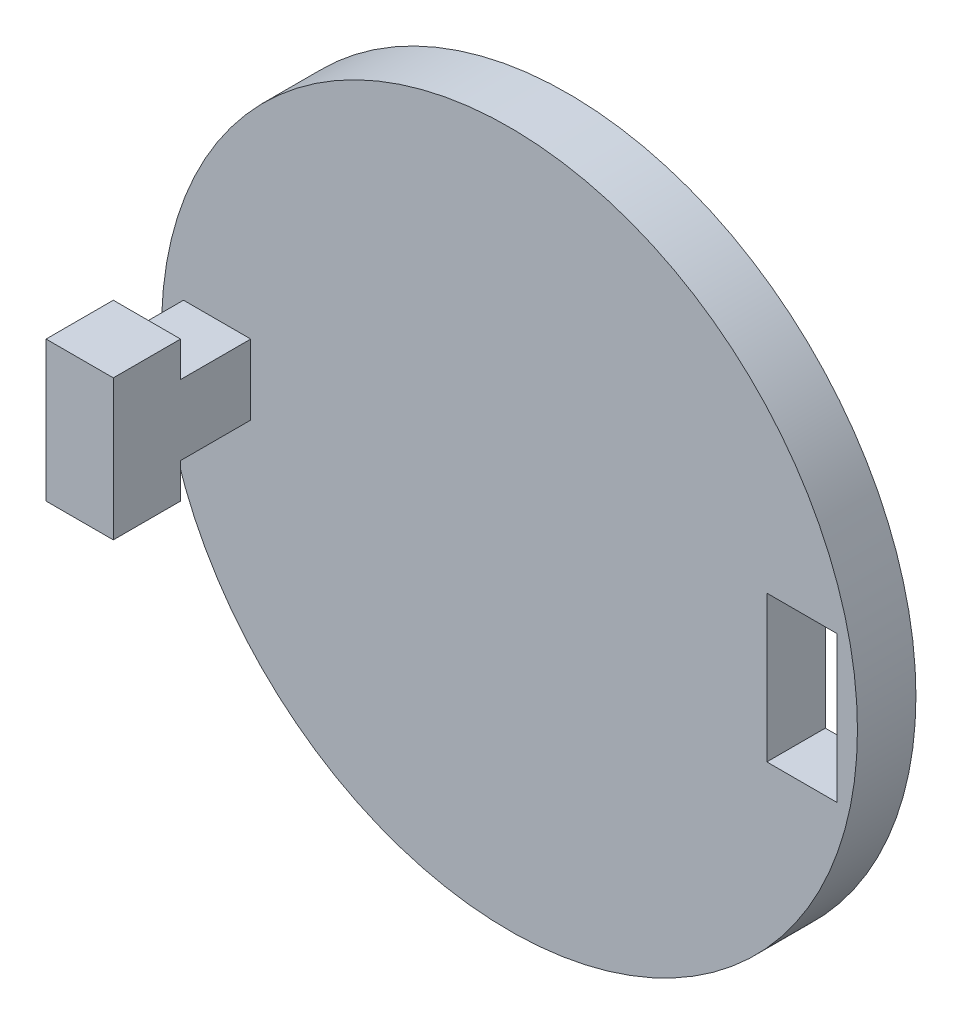
ISO-10303-21;
HEADER;
FILE_DESCRIPTION(('STEP AP214'),'2;1');
FILE_NAME('part.step','',(''),(''),'','','');
FILE_SCHEMA(('AUTOMOTIVE_DESIGN { 1 0 10303 214 1 1 1 1 }'));
ENDSEC;
DATA;
#1=APPLICATION_CONTEXT('core data for automotive mechanical design processes');
#2=APPLICATION_PROTOCOL_DEFINITION('international standard','automotive_design',2000,#1);
#3=PRODUCT_CONTEXT('',#1,'mechanical');
#4=PRODUCT('Part','Part','',(#3));
#5=PRODUCT_RELATED_PRODUCT_CATEGORY('part','',(#4));
#6=PRODUCT_DEFINITION_FORMATION('','',#4);
#7=PRODUCT_DEFINITION_CONTEXT('part definition',#1,'design');
#8=PRODUCT_DEFINITION('design','',#6,#7);
#9=PRODUCT_DEFINITION_SHAPE('','',#8);
#10=(LENGTH_UNIT() NAMED_UNIT(*) SI_UNIT(.MILLI.,.METRE.));
#11=(NAMED_UNIT(*) PLANE_ANGLE_UNIT() SI_UNIT($,.RADIAN.));
#12=(NAMED_UNIT(*) SI_UNIT($,.STERADIAN.) SOLID_ANGLE_UNIT());
#13=UNCERTAINTY_MEASURE_WITH_UNIT(LENGTH_MEASURE(1.E-05),#10,'distance_accuracy_value','');
#14=(GEOMETRIC_REPRESENTATION_CONTEXT(3) GLOBAL_UNCERTAINTY_ASSIGNED_CONTEXT((#13)) GLOBAL_UNIT_ASSIGNED_CONTEXT((#10,
#11,#12)) REPRESENTATION_CONTEXT('',''));
#15=CARTESIAN_POINT('',(0.,0.,0.));
#16=DIRECTION('',(0.,0.,1.));
#17=DIRECTION('',(1.,0.,0.));
#18=AXIS2_PLACEMENT_3D('',#15,#16,#17);
#19=CARTESIAN_POINT('',(-11.15,-1.2,6.7));
#20=DIRECTION('',(0.,1.,0.));
#21=DIRECTION('',(0.,0.,1.));
#22=AXIS2_PLACEMENT_3D('',#19,#20,#21);
#23=PLANE('',#22);
#24=DIRECTION('',(1.,0.,0.));
#25=VECTOR('',#24,1.);
#26=CARTESIAN_POINT('',(-11.15,-1.2,4.4));
#27=LINE('',#26,#25);
#28=CARTESIAN_POINT('',(-11.15,-1.2,4.4));
#29=VERTEX_POINT('',#28);
#30=CARTESIAN_POINT('',(-8.85,-1.2,4.4));
#31=VERTEX_POINT('',#30);
#32=EDGE_CURVE('E145',#29,#31,#27,.T.);
#33=ORIENTED_EDGE('',*,*,#32,.F.);
#34=DIRECTION('',(0.,0.,-1.));
#35=VECTOR('',#34,1.);
#36=CARTESIAN_POINT('',(-11.15,-1.2,6.7));
#37=LINE('',#36,#35);
#38=CARTESIAN_POINT('',(-11.15,-1.2,2.));
#39=VERTEX_POINT('',#38);
#40=EDGE_CURVE('E51',#29,#39,#37,.T.);
#41=ORIENTED_EDGE('',*,*,#40,.T.);
#42=DIRECTION('',(1.,0.,0.));
#43=VECTOR('',#42,1.);
#44=CARTESIAN_POINT('',(-11.15,-1.2,2.));
#45=LINE('',#44,#43);
#46=CARTESIAN_POINT('',(-8.85,-1.2,2.));
#47=VERTEX_POINT('',#46);
#48=EDGE_CURVE('E174',#39,#47,#45,.T.);
#49=ORIENTED_EDGE('',*,*,#48,.T.);
#50=DIRECTION('',(0.,0.,-1.));
#51=VECTOR('',#50,1.);
#52=CARTESIAN_POINT('',(-8.85,-1.2,6.7));
#53=LINE('',#52,#51);
#54=EDGE_CURVE('E176',#31,#47,#53,.T.);
#55=ORIENTED_EDGE('',*,*,#54,.F.);
#56=EDGE_LOOP('',(#33,#41,#49,#55));
#57=FACE_BOUND('',#56,.T.);
#58=ADVANCED_FACE('F36',(#57),#23,.F.);
#59=CARTESIAN_POINT('',(-11.15,1.2,6.7));
#60=DIRECTION('',(0.,-1.,0.));
#61=DIRECTION('',(1.,0.,0.));
#62=AXIS2_PLACEMENT_3D('',#59,#60,#61);
#63=PLANE('',#62);
#64=DIRECTION('',(-1.,0.,0.));
#65=VECTOR('',#64,1.);
#66=CARTESIAN_POINT('',(-8.85,1.2,4.4));
#67=LINE('',#66,#65);
#68=CARTESIAN_POINT('',(-8.85,1.2,4.4));
#69=VERTEX_POINT('',#68);
#70=CARTESIAN_POINT('',(-11.15,1.2,4.4));
#71=VERTEX_POINT('',#70);
#72=EDGE_CURVE('E148',#69,#71,#67,.T.);
#73=ORIENTED_EDGE('',*,*,#72,.F.);
#74=DIRECTION('',(0.,0.,-1.));
#75=VECTOR('',#74,1.);
#76=CARTESIAN_POINT('',(-8.85,1.2,6.7));
#77=LINE('',#76,#75);
#78=CARTESIAN_POINT('',(-8.85,1.2,2.));
#79=VERTEX_POINT('',#78);
#80=EDGE_CURVE('E189',#69,#79,#77,.T.);
#81=ORIENTED_EDGE('',*,*,#80,.T.);
#82=DIRECTION('',(-1.,0.,0.));
#83=VECTOR('',#82,1.);
#84=CARTESIAN_POINT('',(-11.15,1.2,2.));
#85=LINE('',#84,#83);
#86=CARTESIAN_POINT('',(-11.15,1.2,2.));
#87=VERTEX_POINT('',#86);
#88=EDGE_CURVE('E179',#79,#87,#85,.T.);
#89=ORIENTED_EDGE('',*,*,#88,.T.);
#90=DIRECTION('',(0.,0.,-1.));
#91=VECTOR('',#90,1.);
#92=CARTESIAN_POINT('',(-11.15,1.2,6.7));
#93=LINE('',#92,#91);
#94=EDGE_CURVE('E187',#71,#87,#93,.T.);
#95=ORIENTED_EDGE('',*,*,#94,.F.);
#96=EDGE_LOOP('',(#73,#81,#89,#95));
#97=FACE_BOUND('',#96,.T.);
#98=ADVANCED_FACE('F254',(#97),#63,.F.);
#99=CARTESIAN_POINT('',(0.,0.,2.));
#100=DIRECTION('',(0.,0.,1.));
#101=DIRECTION('',(1.,0.,0.));
#102=AXIS2_PLACEMENT_3D('',#99,#100,#101);
#103=PLANE('',#102);
#104=CARTESIAN_POINT('',(0.,0.,2.));
#105=DIRECTION('',(0.,0.,1.));
#106=DIRECTION('',(1.,0.,0.));
#107=AXIS2_PLACEMENT_3D('',#104,#105,#106);
#108=CIRCLE('',#107,11.9);
#109=CARTESIAN_POINT('',(11.9,0.,2.));
#110=VERTEX_POINT('',#109);
#111=EDGE_CURVE('E11',#110,#110,#108,.T.);
#112=ORIENTED_EDGE('',*,*,#111,.T.);
#113=EDGE_LOOP('',(#112));
#114=FACE_BOUND('',#113,.T.);
#115=DIRECTION('',(-1.,0.,0.));
#116=VECTOR('',#115,1.);
#117=CARTESIAN_POINT('',(8.8,2.5,2.));
#118=LINE('',#117,#116);
#119=CARTESIAN_POINT('',(11.2,2.5,2.));
#120=VERTEX_POINT('',#119);
#121=CARTESIAN_POINT('',(8.8,2.5,2.));
#122=VERTEX_POINT('',#121);
#123=EDGE_CURVE('E194',#120,#122,#118,.T.);
#124=ORIENTED_EDGE('',*,*,#123,.F.);
#125=DIRECTION('',(0.,1.,0.));
#126=VECTOR('',#125,1.);
#127=CARTESIAN_POINT('',(11.2,2.5,2.));
#128=LINE('',#127,#126);
#129=CARTESIAN_POINT('',(11.2,-2.5,2.));
#130=VERTEX_POINT('',#129);
#131=EDGE_CURVE('E192',#130,#120,#128,.T.);
#132=ORIENTED_EDGE('',*,*,#131,.F.);
#133=DIRECTION('',(1.,0.,0.));
#134=VECTOR('',#133,1.);
#135=CARTESIAN_POINT('',(8.8,-2.5,2.));
#136=LINE('',#135,#134);
#137=CARTESIAN_POINT('',(8.8,-2.5,2.));
#138=VERTEX_POINT('',#137);
#139=EDGE_CURVE('E199',#138,#130,#136,.T.);
#140=ORIENTED_EDGE('',*,*,#139,.F.);
#141=DIRECTION('',(0.,-1.,0.));
#142=VECTOR('',#141,1.);
#143=CARTESIAN_POINT('',(8.8,2.5,2.));
#144=LINE('',#143,#142);
#145=EDGE_CURVE('E197',#122,#138,#144,.T.);
#146=ORIENTED_EDGE('',*,*,#145,.F.);
#147=EDGE_LOOP('',(#124,#132,#140,#146));
#148=FACE_BOUND('',#147,.T.);
#149=ORIENTED_EDGE('',*,*,#88,.F.);
#150=DIRECTION('',(0.,1.,0.));
#151=VECTOR('',#150,1.);
#152=CARTESIAN_POINT('',(-8.85,1.2,2.));
#153=LINE('',#152,#151);
#154=EDGE_CURVE('E170',#47,#79,#153,.T.);
#155=ORIENTED_EDGE('',*,*,#154,.F.);
#156=ORIENTED_EDGE('',*,*,#48,.F.);
#157=DIRECTION('',(0.,-1.,0.));
#158=VECTOR('',#157,1.);
#159=CARTESIAN_POINT('',(-11.15,1.2,2.));
#160=LINE('',#159,#158);
#161=EDGE_CURVE('E182',#87,#39,#160,.T.);
#162=ORIENTED_EDGE('',*,*,#161,.F.);
#163=EDGE_LOOP('',(#149,#155,#156,#162));
#164=FACE_BOUND('',#163,.T.);
#165=ADVANCED_FACE('F228',(#114,#148,#164),#103,.T.);
#166=CARTESIAN_POINT('',(0.,0.,0.));
#167=DIRECTION('',(0.,0.,1.));
#168=DIRECTION('',(1.,0.,0.));
#169=AXIS2_PLACEMENT_3D('',#166,#167,#168);
#170=PLANE('',#169);
#171=CARTESIAN_POINT('',(0.,0.,0.));
#172=DIRECTION('',(0.,0.,1.));
#173=DIRECTION('',(1.,0.,0.));
#174=AXIS2_PLACEMENT_3D('',#171,#172,#173);
#175=CIRCLE('',#174,11.9);
#176=CARTESIAN_POINT('',(11.9,0.,0.));
#177=VERTEX_POINT('',#176);
#178=EDGE_CURVE('E40',#177,#177,#175,.T.);
#179=ORIENTED_EDGE('',*,*,#178,.F.);
#180=EDGE_LOOP('',(#179));
#181=FACE_BOUND('',#180,.T.);
#182=DIRECTION('',(0.,1.,0.));
#183=VECTOR('',#182,1.);
#184=CARTESIAN_POINT('',(11.2,2.5,0.));
#185=LINE('',#184,#183);
#186=CARTESIAN_POINT('',(11.2,-2.5,0.));
#187=VERTEX_POINT('',#186);
#188=CARTESIAN_POINT('',(11.2,2.5,0.));
#189=VERTEX_POINT('',#188);
#190=EDGE_CURVE('E191',#187,#189,#185,.T.);
#191=ORIENTED_EDGE('',*,*,#190,.T.);
#192=DIRECTION('',(-1.,0.,0.));
#193=VECTOR('',#192,1.);
#194=CARTESIAN_POINT('',(8.8,2.5,0.));
#195=LINE('',#194,#193);
#196=CARTESIAN_POINT('',(8.8,2.5,0.));
#197=VERTEX_POINT('',#196);
#198=EDGE_CURVE('E204',#189,#197,#195,.T.);
#199=ORIENTED_EDGE('',*,*,#198,.T.);
#200=DIRECTION('',(0.,-1.,0.));
#201=VECTOR('',#200,1.);
#202=CARTESIAN_POINT('',(8.8,2.5,0.));
#203=LINE('',#202,#201);
#204=CARTESIAN_POINT('',(8.8,-2.5,0.));
#205=VERTEX_POINT('',#204);
#206=EDGE_CURVE('E207',#197,#205,#203,.T.);
#207=ORIENTED_EDGE('',*,*,#206,.T.);
#208=DIRECTION('',(1.,0.,0.));
#209=VECTOR('',#208,1.);
#210=CARTESIAN_POINT('',(8.8,-2.5,0.));
#211=LINE('',#210,#209);
#212=EDGE_CURVE('E195',#205,#187,#211,.T.);
#213=ORIENTED_EDGE('',*,*,#212,.T.);
#214=EDGE_LOOP('',(#191,#199,#207,#213));
#215=FACE_BOUND('',#214,.T.);
#216=ADVANCED_FACE('F225',(#181,#215),#170,.F.);
#217=CARTESIAN_POINT('',(0.,0.,2.));
#218=DIRECTION('',(0.,0.,-1.));
#219=DIRECTION('',(-1.,0.,0.));
#220=AXIS2_PLACEMENT_3D('',#217,#218,#219);
#221=CYLINDRICAL_SURFACE('',#220,11.9);
#222=ORIENTED_EDGE('',*,*,#111,.F.);
#223=EDGE_LOOP('',(#222));
#224=FACE_BOUND('',#223,.T.);
#225=ORIENTED_EDGE('',*,*,#178,.T.);
#226=EDGE_LOOP('',(#225));
#227=FACE_BOUND('',#226,.T.);
#228=ADVANCED_FACE('F38',(#224,#227),#221,.T.);
#229=CARTESIAN_POINT('',(11.2,2.5,2.));
#230=DIRECTION('',(-1.,0.,0.));
#231=DIRECTION('',(0.,-1.,0.));
#232=AXIS2_PLACEMENT_3D('',#229,#230,#231);
#233=PLANE('',#232);
#234=ORIENTED_EDGE('',*,*,#190,.F.);
#235=DIRECTION('',(0.,0.,-1.));
#236=VECTOR('',#235,1.);
#237=CARTESIAN_POINT('',(11.2,-2.5,2.));
#238=LINE('',#237,#236);
#239=EDGE_CURVE('E201',#130,#187,#238,.T.);
#240=ORIENTED_EDGE('',*,*,#239,.F.);
#241=ORIENTED_EDGE('',*,*,#131,.T.);
#242=DIRECTION('',(0.,0.,-1.));
#243=VECTOR('',#242,1.);
#244=CARTESIAN_POINT('',(11.2,2.5,2.));
#245=LINE('',#244,#243);
#246=EDGE_CURVE('E217',#120,#189,#245,.T.);
#247=ORIENTED_EDGE('',*,*,#246,.T.);
#248=EDGE_LOOP('',(#234,#240,#241,#247));
#249=FACE_BOUND('',#248,.T.);
#250=ADVANCED_FACE('F230',(#249),#233,.T.);
#251=CARTESIAN_POINT('',(8.8,2.5,2.));
#252=DIRECTION('',(0.,-1.,0.));
#253=DIRECTION('',(0.,0.,-1.));
#254=AXIS2_PLACEMENT_3D('',#251,#252,#253);
#255=PLANE('',#254);
#256=ORIENTED_EDGE('',*,*,#198,.F.);
#257=ORIENTED_EDGE('',*,*,#246,.F.);
#258=ORIENTED_EDGE('',*,*,#123,.T.);
#259=DIRECTION('',(0.,0.,-1.));
#260=VECTOR('',#259,1.);
#261=CARTESIAN_POINT('',(8.8,2.5,2.));
#262=LINE('',#261,#260);
#263=EDGE_CURVE('E215',#122,#197,#262,.T.);
#264=ORIENTED_EDGE('',*,*,#263,.T.);
#265=EDGE_LOOP('',(#256,#257,#258,#264));
#266=FACE_BOUND('',#265,.T.);
#267=ADVANCED_FACE('F239',(#266),#255,.T.);
#268=CARTESIAN_POINT('',(8.8,2.5,2.));
#269=DIRECTION('',(1.,0.,0.));
#270=DIRECTION('',(0.,0.,-1.));
#271=AXIS2_PLACEMENT_3D('',#268,#269,#270);
#272=PLANE('',#271);
#273=ORIENTED_EDGE('',*,*,#206,.F.);
#274=ORIENTED_EDGE('',*,*,#263,.F.);
#275=ORIENTED_EDGE('',*,*,#145,.T.);
#276=DIRECTION('',(0.,0.,-1.));
#277=VECTOR('',#276,1.);
#278=CARTESIAN_POINT('',(8.8,-2.5,2.));
#279=LINE('',#278,#277);
#280=EDGE_CURVE('E59',#138,#205,#279,.T.);
#281=ORIENTED_EDGE('',*,*,#280,.T.);
#282=EDGE_LOOP('',(#273,#274,#275,#281));
#283=FACE_BOUND('',#282,.T.);
#284=ADVANCED_FACE('F243',(#283),#272,.T.);
#285=CARTESIAN_POINT('',(8.8,-2.5,2.));
#286=DIRECTION('',(0.,1.,0.));
#287=DIRECTION('',(0.,0.,1.));
#288=AXIS2_PLACEMENT_3D('',#285,#286,#287);
#289=PLANE('',#288);
#290=ORIENTED_EDGE('',*,*,#212,.F.);
#291=ORIENTED_EDGE('',*,*,#280,.F.);
#292=ORIENTED_EDGE('',*,*,#139,.T.);
#293=ORIENTED_EDGE('',*,*,#239,.T.);
#294=EDGE_LOOP('',(#290,#291,#292,#293));
#295=FACE_BOUND('',#294,.T.);
#296=ADVANCED_FACE('F232',(#295),#289,.T.);
#297=CARTESIAN_POINT('',(-8.85,1.2,6.7));
#298=DIRECTION('',(-1.,0.,0.));
#299=DIRECTION('',(0.,0.,1.));
#300=AXIS2_PLACEMENT_3D('',#297,#298,#299);
#301=PLANE('',#300);
#302=ORIENTED_EDGE('',*,*,#154,.T.);
#303=ORIENTED_EDGE('',*,*,#80,.F.);
#304=DIRECTION('',(0.,-1.,0.));
#305=VECTOR('',#304,1.);
#306=CARTESIAN_POINT('',(-8.85,2.4,4.4));
#307=LINE('',#306,#305);
#308=CARTESIAN_POINT('',(-8.85,2.4,4.4));
#309=VERTEX_POINT('',#308);
#310=EDGE_CURVE('E168',#309,#69,#307,.T.);
#311=ORIENTED_EDGE('',*,*,#310,.F.);
#312=DIRECTION('',(0.,0.,-1.));
#313=VECTOR('',#312,1.);
#314=CARTESIAN_POINT('',(-8.85,2.4,6.7));
#315=LINE('',#314,#313);
#316=CARTESIAN_POINT('',(-8.85,2.4,6.7));
#317=VERTEX_POINT('',#316);
#318=EDGE_CURVE('E150',#317,#309,#315,.T.);
#319=ORIENTED_EDGE('',*,*,#318,.F.);
#320=DIRECTION('',(0.,1.,0.));
#321=VECTOR('',#320,1.);
#322=CARTESIAN_POINT('',(-8.85,1.2,6.7));
#323=LINE('',#322,#321);
#324=CARTESIAN_POINT('',(-8.85,-2.4,6.7));
#325=VERTEX_POINT('',#324);
#326=EDGE_CURVE('E171',#325,#317,#323,.T.);
#327=ORIENTED_EDGE('',*,*,#326,.F.);
#328=DIRECTION('',(0.,0.,1.));
#329=VECTOR('',#328,1.);
#330=CARTESIAN_POINT('',(-8.85,-2.4,6.7));
#331=LINE('',#330,#329);
#332=CARTESIAN_POINT('',(-8.85,-2.4,4.4));
#333=VERTEX_POINT('',#332);
#334=EDGE_CURVE('E136',#333,#325,#331,.T.);
#335=ORIENTED_EDGE('',*,*,#334,.F.);
#336=DIRECTION('',(0.,1.,0.));
#337=VECTOR('',#336,1.);
#338=CARTESIAN_POINT('',(-8.85,-2.4,4.4));
#339=LINE('',#338,#337);
#340=EDGE_CURVE('E132',#333,#31,#339,.T.);
#341=ORIENTED_EDGE('',*,*,#340,.T.);
#342=ORIENTED_EDGE('',*,*,#54,.T.);
#343=EDGE_LOOP('',(#302,#303,#311,#319,#327,#335,#341,#342));
#344=FACE_BOUND('',#343,.T.);
#345=ADVANCED_FACE('F250',(#344),#301,.F.);
#346=CARTESIAN_POINT('',(-11.15,1.2,6.7));
#347=DIRECTION('',(1.,0.,0.));
#348=DIRECTION('',(0.,0.,-1.));
#349=AXIS2_PLACEMENT_3D('',#346,#347,#348);
#350=PLANE('',#349);
#351=ORIENTED_EDGE('',*,*,#161,.T.);
#352=ORIENTED_EDGE('',*,*,#40,.F.);
#353=DIRECTION('',(0.,1.,0.));
#354=VECTOR('',#353,1.);
#355=CARTESIAN_POINT('',(-11.15,-2.4,4.4));
#356=LINE('',#355,#354);
#357=CARTESIAN_POINT('',(-11.15,-2.4,4.4));
#358=VERTEX_POINT('',#357);
#359=EDGE_CURVE('E130',#358,#29,#356,.T.);
#360=ORIENTED_EDGE('',*,*,#359,.F.);
#361=DIRECTION('',(0.,0.,-1.));
#362=VECTOR('',#361,1.);
#363=CARTESIAN_POINT('',(-11.15,-2.4,6.7));
#364=LINE('',#363,#362);
#365=CARTESIAN_POINT('',(-11.15,-2.4,6.7));
#366=VERTEX_POINT('',#365);
#367=EDGE_CURVE('E137',#366,#358,#364,.T.);
#368=ORIENTED_EDGE('',*,*,#367,.F.);
#369=DIRECTION('',(0.,-1.,0.));
#370=VECTOR('',#369,1.);
#371=CARTESIAN_POINT('',(-11.15,1.2,6.7));
#372=LINE('',#371,#370);
#373=CARTESIAN_POINT('',(-11.15,2.4,6.7));
#374=VERTEX_POINT('',#373);
#375=EDGE_CURVE('E173',#374,#366,#372,.T.);
#376=ORIENTED_EDGE('',*,*,#375,.F.);
#377=DIRECTION('',(0.,0.,1.));
#378=VECTOR('',#377,1.);
#379=CARTESIAN_POINT('',(-11.15,2.4,6.7));
#380=LINE('',#379,#378);
#381=CARTESIAN_POINT('',(-11.15,2.4,4.4));
#382=VERTEX_POINT('',#381);
#383=EDGE_CURVE('E159',#382,#374,#380,.T.);
#384=ORIENTED_EDGE('',*,*,#383,.F.);
#385=DIRECTION('',(0.,-1.,0.));
#386=VECTOR('',#385,1.);
#387=CARTESIAN_POINT('',(-11.15,2.4,4.4));
#388=LINE('',#387,#386);
#389=EDGE_CURVE('E164',#382,#71,#388,.T.);
#390=ORIENTED_EDGE('',*,*,#389,.T.);
#391=ORIENTED_EDGE('',*,*,#94,.T.);
#392=EDGE_LOOP('',(#351,#352,#360,#368,#376,#384,#390,#391));
#393=FACE_BOUND('',#392,.T.);
#394=ADVANCED_FACE('F147',(#393),#350,.F.);
#395=CARTESIAN_POINT('',(0.,0.,6.7));
#396=DIRECTION('',(0.,0.,1.));
#397=DIRECTION('',(1.,0.,0.));
#398=AXIS2_PLACEMENT_3D('',#395,#396,#397);
#399=PLANE('',#398);
#400=ORIENTED_EDGE('',*,*,#326,.T.);
#401=DIRECTION('',(1.,0.,0.));
#402=VECTOR('',#401,1.);
#403=CARTESIAN_POINT('',(-8.85,2.4,6.7));
#404=LINE('',#403,#402);
#405=EDGE_CURVE('E162',#374,#317,#404,.T.);
#406=ORIENTED_EDGE('',*,*,#405,.F.);
#407=ORIENTED_EDGE('',*,*,#375,.T.);
#408=DIRECTION('',(-1.,0.,0.));
#409=VECTOR('',#408,1.);
#410=CARTESIAN_POINT('',(-11.15,-2.4,6.7));
#411=LINE('',#410,#409);
#412=EDGE_CURVE('E143',#325,#366,#411,.T.);
#413=ORIENTED_EDGE('',*,*,#412,.F.);
#414=EDGE_LOOP('',(#400,#406,#407,#413));
#415=FACE_BOUND('',#414,.T.);
#416=ADVANCED_FACE('F263',(#415),#399,.T.);
#417=CARTESIAN_POINT('',(-8.85,2.4,4.4));
#418=DIRECTION('',(0.,0.,1.));
#419=DIRECTION('',(1.,0.,0.));
#420=AXIS2_PLACEMENT_3D('',#417,#418,#419);
#421=PLANE('',#420);
#422=ORIENTED_EDGE('',*,*,#72,.T.);
#423=ORIENTED_EDGE('',*,*,#389,.F.);
#424=DIRECTION('',(-1.,0.,0.));
#425=VECTOR('',#424,1.);
#426=CARTESIAN_POINT('',(-8.85,2.4,4.4));
#427=LINE('',#426,#425);
#428=EDGE_CURVE('E157',#309,#382,#427,.T.);
#429=ORIENTED_EDGE('',*,*,#428,.F.);
#430=ORIENTED_EDGE('',*,*,#310,.T.);
#431=EDGE_LOOP('',(#422,#423,#429,#430));
#432=FACE_BOUND('',#431,.T.);
#433=ADVANCED_FACE('F282',(#432),#421,.F.);
#434=CARTESIAN_POINT('',(0.,2.4,0.));
#435=DIRECTION('',(0.,1.,0.));
#436=DIRECTION('',(-1.,0.,0.));
#437=AXIS2_PLACEMENT_3D('',#434,#435,#436);
#438=PLANE('',#437);
#439=ORIENTED_EDGE('',*,*,#318,.T.);
#440=ORIENTED_EDGE('',*,*,#428,.T.);
#441=ORIENTED_EDGE('',*,*,#383,.T.);
#442=ORIENTED_EDGE('',*,*,#405,.T.);
#443=EDGE_LOOP('',(#439,#440,#441,#442));
#444=FACE_BOUND('',#443,.T.);
#445=ADVANCED_FACE('F286',(#444),#438,.T.);
#446=CARTESIAN_POINT('',(-11.15,-2.4,4.4));
#447=DIRECTION('',(0.,0.,1.));
#448=DIRECTION('',(1.,0.,0.));
#449=AXIS2_PLACEMENT_3D('',#446,#447,#448);
#450=PLANE('',#449);
#451=ORIENTED_EDGE('',*,*,#32,.T.);
#452=ORIENTED_EDGE('',*,*,#340,.F.);
#453=DIRECTION('',(1.,0.,0.));
#454=VECTOR('',#453,1.);
#455=CARTESIAN_POINT('',(-11.15,-2.4,4.4));
#456=LINE('',#455,#454);
#457=EDGE_CURVE('E126',#358,#333,#456,.T.);
#458=ORIENTED_EDGE('',*,*,#457,.F.);
#459=ORIENTED_EDGE('',*,*,#359,.T.);
#460=EDGE_LOOP('',(#451,#452,#458,#459));
#461=FACE_BOUND('',#460,.T.);
#462=ADVANCED_FACE('F128',(#461),#450,.F.);
#463=CARTESIAN_POINT('',(0.,-2.4,0.));
#464=DIRECTION('',(0.,-1.,0.));
#465=DIRECTION('',(0.,0.,-1.));
#466=AXIS2_PLACEMENT_3D('',#463,#464,#465);
#467=PLANE('',#466);
#468=ORIENTED_EDGE('',*,*,#367,.T.);
#469=ORIENTED_EDGE('',*,*,#457,.T.);
#470=ORIENTED_EDGE('',*,*,#334,.T.);
#471=ORIENTED_EDGE('',*,*,#412,.T.);
#472=EDGE_LOOP('',(#468,#469,#470,#471));
#473=FACE_BOUND('',#472,.T.);
#474=ADVANCED_FACE('F141',(#473),#467,.T.);
#475=CLOSED_SHELL('',(#58,#98,#165,#216,#228,#250,#267,#284,#296,#345,#394,#416,#433,#445,#462,#474));
#476=MANIFOLD_SOLID_BREP('B2',#475);
#477=ADVANCED_BREP_SHAPE_REPRESENTATION('',(#18,#476),#14);
#478=SHAPE_DEFINITION_REPRESENTATION(#9,#477);
ENDSEC;
END-ISO-10303-21;
